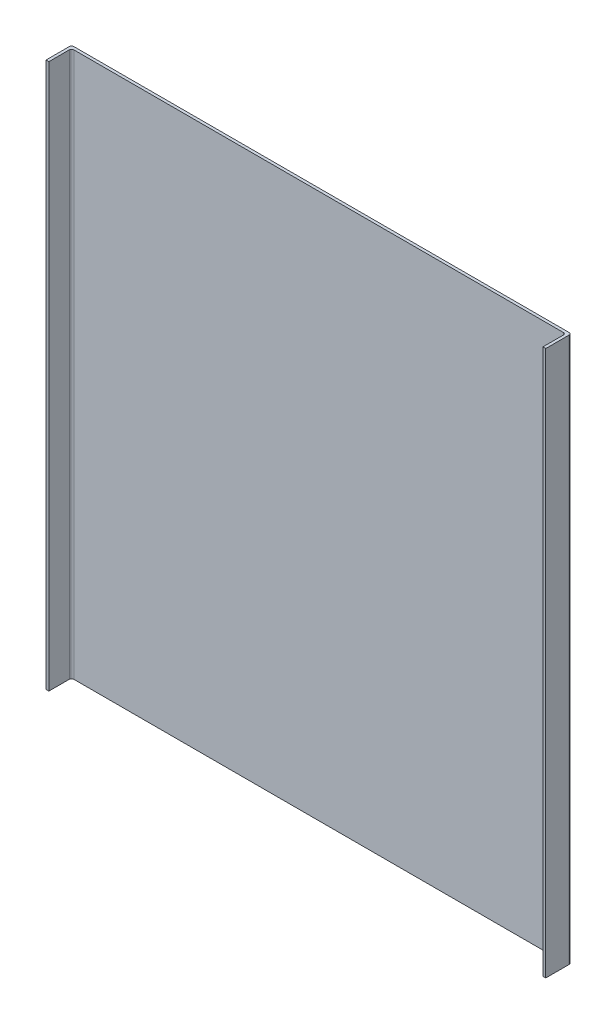
ISO-10303-21;
HEADER;
FILE_DESCRIPTION(('STEP AP214'),'2;1');
FILE_NAME('part.step','',(''),(''),'','','');
FILE_SCHEMA(('AUTOMOTIVE_DESIGN { 1 0 10303 214 1 1 1 1 }'));
ENDSEC;
DATA;
#1=APPLICATION_CONTEXT('core data for automotive mechanical design processes');
#2=APPLICATION_PROTOCOL_DEFINITION('international standard','automotive_design',2000,#1);
#3=PRODUCT_CONTEXT('',#1,'mechanical');
#4=PRODUCT('Part','Part','',(#3));
#5=PRODUCT_RELATED_PRODUCT_CATEGORY('part','',(#4));
#6=PRODUCT_DEFINITION_FORMATION('','',#4);
#7=PRODUCT_DEFINITION_CONTEXT('part definition',#1,'design');
#8=PRODUCT_DEFINITION('design','',#6,#7);
#9=PRODUCT_DEFINITION_SHAPE('','',#8);
#10=(LENGTH_UNIT() NAMED_UNIT(*) SI_UNIT(.MILLI.,.METRE.));
#11=(NAMED_UNIT(*) PLANE_ANGLE_UNIT() SI_UNIT($,.RADIAN.));
#12=(NAMED_UNIT(*) SI_UNIT($,.STERADIAN.) SOLID_ANGLE_UNIT());
#13=UNCERTAINTY_MEASURE_WITH_UNIT(LENGTH_MEASURE(1.E-05),#10,'distance_accuracy_value','');
#14=(GEOMETRIC_REPRESENTATION_CONTEXT(3) GLOBAL_UNCERTAINTY_ASSIGNED_CONTEXT((#13)) GLOBAL_UNIT_ASSIGNED_CONTEXT((#10,
#11,#12)) REPRESENTATION_CONTEXT('',''));
#15=CARTESIAN_POINT('',(0.,0.,0.));
#16=DIRECTION('',(0.,0.,1.));
#17=DIRECTION('',(1.,0.,0.));
#18=AXIS2_PLACEMENT_3D('',#15,#16,#17);
#19=CARTESIAN_POINT('',(0.,0.,6.35));
#20=DIRECTION('',(0.,0.,-1.));
#21=DIRECTION('',(-1.,0.,0.));
#22=AXIS2_PLACEMENT_3D('',#19,#20,#21);
#23=PLANE('',#22);
#24=DIRECTION('',(1.,0.,0.));
#25=VECTOR('',#24,1.);
#26=CARTESIAN_POINT('',(0.,0.,6.35));
#27=LINE('',#26,#25);
#28=CARTESIAN_POINT('',(11.3500000000001,0.,6.35));
#29=VERTEX_POINT('',#28);
#30=CARTESIAN_POINT('',(1106.25,0.,6.35));
#31=VERTEX_POINT('',#30);
#32=EDGE_CURVE('E197',#29,#31,#27,.T.);
#33=ORIENTED_EDGE('',*,*,#32,.T.);
#34=DIRECTION('',(0.,-1.,0.));
#35=VECTOR('',#34,1.);
#36=CARTESIAN_POINT('',(1106.25,1219.2,6.35));
#37=LINE('',#36,#35);
#38=CARTESIAN_POINT('',(1106.25,1219.2,6.35));
#39=VERTEX_POINT('',#38);
#40=EDGE_CURVE('E244',#31,#39,#37,.F.);
#41=ORIENTED_EDGE('',*,*,#40,.T.);
#42=DIRECTION('',(1.,0.,0.));
#43=VECTOR('',#42,1.);
#44=CARTESIAN_POINT('',(0.,1219.2,6.35));
#45=LINE('',#44,#43);
#46=CARTESIAN_POINT('',(11.35,1219.2,6.35));
#47=VERTEX_POINT('',#46);
#48=EDGE_CURVE('E193',#47,#39,#45,.T.);
#49=ORIENTED_EDGE('',*,*,#48,.F.);
#50=DIRECTION('',(0.,1.,0.));
#51=VECTOR('',#50,1.);
#52=CARTESIAN_POINT('',(11.3500000000001,0.,6.35));
#53=LINE('',#52,#51);
#54=EDGE_CURVE('E241',#47,#29,#53,.F.);
#55=ORIENTED_EDGE('',*,*,#54,.T.);
#56=EDGE_LOOP('',(#33,#41,#49,#55));
#57=FACE_BOUND('',#56,.T.);
#58=ADVANCED_FACE('F45',(#57),#23,.F.);
#59=CARTESIAN_POINT('',(0.,0.,6.35));
#60=DIRECTION('',(-1.,0.,0.));
#61=DIRECTION('',(0.,0.,1.));
#62=AXIS2_PLACEMENT_3D('',#59,#60,#61);
#63=PLANE('',#62);
#64=DIRECTION('',(0.,0.,-1.));
#65=VECTOR('',#64,1.);
#66=CARTESIAN_POINT('',(0.,1219.2,6.35));
#67=LINE('',#66,#65);
#68=CARTESIAN_POINT('',(0.,1219.2,57.15));
#69=VERTEX_POINT('',#68);
#70=CARTESIAN_POINT('',(0.,1219.2,5.));
#71=VERTEX_POINT('',#70);
#72=EDGE_CURVE('E202',#69,#71,#67,.T.);
#73=ORIENTED_EDGE('',*,*,#72,.T.);
#74=DIRECTION('',(0.,1.,0.));
#75=VECTOR('',#74,1.);
#76=CARTESIAN_POINT('',(0.,0.,5.));
#77=LINE('',#76,#75);
#78=CARTESIAN_POINT('',(0.,0.,5.));
#79=VERTEX_POINT('',#78);
#80=EDGE_CURVE('E61',#71,#79,#77,.F.);
#81=ORIENTED_EDGE('',*,*,#80,.T.);
#82=DIRECTION('',(0.,0.,-1.));
#83=VECTOR('',#82,1.);
#84=CARTESIAN_POINT('',(0.,0.,6.35));
#85=LINE('',#84,#83);
#86=CARTESIAN_POINT('',(0.,0.,57.15));
#87=VERTEX_POINT('',#86);
#88=EDGE_CURVE('E148',#87,#79,#85,.T.);
#89=ORIENTED_EDGE('',*,*,#88,.F.);
#90=DIRECTION('',(0.,-1.,0.));
#91=VECTOR('',#90,1.);
#92=CARTESIAN_POINT('',(0.,1219.2,57.15));
#93=LINE('',#92,#91);
#94=EDGE_CURVE('E165',#69,#87,#93,.T.);
#95=ORIENTED_EDGE('',*,*,#94,.F.);
#96=EDGE_LOOP('',(#73,#81,#89,#95));
#97=FACE_BOUND('',#96,.T.);
#98=ADVANCED_FACE('F276',(#97),#63,.T.);
#99=CARTESIAN_POINT('',(0.,0.,6.35));
#100=DIRECTION('',(0.,1.,0.));
#101=DIRECTION('',(0.,0.,1.));
#102=AXIS2_PLACEMENT_3D('',#99,#100,#101);
#103=PLANE('',#102);
#104=DIRECTION('',(1.,0.,0.));
#105=VECTOR('',#104,1.);
#106=CARTESIAN_POINT('',(0.,0.,0.));
#107=LINE('',#106,#105);
#108=CARTESIAN_POINT('',(5.,0.,0.));
#109=VERTEX_POINT('',#108);
#110=CARTESIAN_POINT('',(1112.6,0.,0.));
#111=VERTEX_POINT('',#110);
#112=EDGE_CURVE('E198',#109,#111,#107,.T.);
#113=ORIENTED_EDGE('',*,*,#112,.T.);
#114=CARTESIAN_POINT('',(1112.6,0.,5.));
#115=DIRECTION('',(0.,1.,0.));
#116=DIRECTION('',(0.,0.,1.));
#117=AXIS2_PLACEMENT_3D('',#114,#115,#116);
#118=CIRCLE('',#117,5.);
#119=CARTESIAN_POINT('',(1117.6,0.,5.));
#120=VERTEX_POINT('',#119);
#121=EDGE_CURVE('E142',#111,#120,#118,.F.);
#122=ORIENTED_EDGE('',*,*,#121,.T.);
#123=DIRECTION('',(0.,0.,-1.));
#124=VECTOR('',#123,1.);
#125=CARTESIAN_POINT('',(1117.6,0.,6.35));
#126=LINE('',#125,#124);
#127=CARTESIAN_POINT('',(1117.6,0.,57.15));
#128=VERTEX_POINT('',#127);
#129=EDGE_CURVE('E135',#128,#120,#126,.T.);
#130=ORIENTED_EDGE('',*,*,#129,.F.);
#131=DIRECTION('',(1.,0.,0.));
#132=VECTOR('',#131,1.);
#133=CARTESIAN_POINT('',(1117.6,0.,57.15));
#134=LINE('',#133,#132);
#135=CARTESIAN_POINT('',(1111.25,0.,57.15));
#136=VERTEX_POINT('',#135);
#137=EDGE_CURVE('E140',#136,#128,#134,.T.);
#138=ORIENTED_EDGE('',*,*,#137,.F.);
#139=DIRECTION('',(0.,0.,-1.));
#140=VECTOR('',#139,1.);
#141=CARTESIAN_POINT('',(1111.25,0.,57.15));
#142=LINE('',#141,#140);
#143=CARTESIAN_POINT('',(1111.25,0.,11.35));
#144=VERTEX_POINT('',#143);
#145=EDGE_CURVE('E159',#136,#144,#142,.T.);
#146=ORIENTED_EDGE('',*,*,#145,.T.);
#147=CARTESIAN_POINT('',(1106.25,0.,11.35));
#148=DIRECTION('',(0.,1.,0.));
#149=DIRECTION('',(0.,0.,1.));
#150=AXIS2_PLACEMENT_3D('',#147,#148,#149);
#151=CIRCLE('',#150,5.);
#152=EDGE_CURVE('E251',#144,#31,#151,.T.);
#153=ORIENTED_EDGE('',*,*,#152,.T.);
#154=ORIENTED_EDGE('',*,*,#32,.F.);
#155=CARTESIAN_POINT('',(11.3500000000001,0.,11.35));
#156=DIRECTION('',(0.,1.,0.));
#157=DIRECTION('',(0.,0.,1.));
#158=AXIS2_PLACEMENT_3D('',#155,#156,#157);
#159=CIRCLE('',#158,5.);
#160=CARTESIAN_POINT('',(6.35000000000015,0.,11.35));
#161=VERTEX_POINT('',#160);
#162=EDGE_CURVE('E11',#29,#161,#159,.T.);
#163=ORIENTED_EDGE('',*,*,#162,.T.);
#164=DIRECTION('',(0.,0.,-1.));
#165=VECTOR('',#164,1.);
#166=CARTESIAN_POINT('',(6.35000000000015,0.,57.15));
#167=LINE('',#166,#165);
#168=CARTESIAN_POINT('',(6.35000000000015,0.,57.15));
#169=VERTEX_POINT('',#168);
#170=EDGE_CURVE('E189',#169,#161,#167,.T.);
#171=ORIENTED_EDGE('',*,*,#170,.F.);
#172=DIRECTION('',(1.,0.,0.));
#173=VECTOR('',#172,1.);
#174=CARTESIAN_POINT('',(0.,0.,57.15));
#175=LINE('',#174,#173);
#176=EDGE_CURVE('E171',#87,#169,#175,.T.);
#177=ORIENTED_EDGE('',*,*,#176,.F.);
#178=ORIENTED_EDGE('',*,*,#88,.T.);
#179=CARTESIAN_POINT('',(5.,0.,5.));
#180=DIRECTION('',(0.,1.,0.));
#181=DIRECTION('',(0.,0.,1.));
#182=AXIS2_PLACEMENT_3D('',#179,#180,#181);
#183=CIRCLE('',#182,5.);
#184=EDGE_CURVE('E230',#79,#109,#183,.F.);
#185=ORIENTED_EDGE('',*,*,#184,.T.);
#186=EDGE_LOOP('',(#113,#122,#130,#138,#146,#153,#154,#163,#171,#177,#178,#185));
#187=FACE_BOUND('',#186,.T.);
#188=ADVANCED_FACE('F138',(#187),#103,.F.);
#189=CARTESIAN_POINT('',(1117.6,0.,6.35));
#190=DIRECTION('',(-1.,0.,0.));
#191=DIRECTION('',(0.,0.,1.));
#192=AXIS2_PLACEMENT_3D('',#189,#190,#191);
#193=PLANE('',#192);
#194=ORIENTED_EDGE('',*,*,#129,.T.);
#195=DIRECTION('',(0.,1.,0.));
#196=VECTOR('',#195,1.);
#197=CARTESIAN_POINT('',(1117.6,1219.2,5.));
#198=LINE('',#197,#196);
#199=CARTESIAN_POINT('',(1117.6,1219.2,5.));
#200=VERTEX_POINT('',#199);
#201=EDGE_CURVE('E209',#120,#200,#198,.T.);
#202=ORIENTED_EDGE('',*,*,#201,.T.);
#203=DIRECTION('',(0.,0.,-1.));
#204=VECTOR('',#203,1.);
#205=CARTESIAN_POINT('',(1117.6,1219.2,6.35));
#206=LINE('',#205,#204);
#207=CARTESIAN_POINT('',(1117.6,1219.2,57.15));
#208=VERTEX_POINT('',#207);
#209=EDGE_CURVE('E149',#208,#200,#206,.T.);
#210=ORIENTED_EDGE('',*,*,#209,.F.);
#211=DIRECTION('',(0.,1.,0.));
#212=VECTOR('',#211,1.);
#213=CARTESIAN_POINT('',(1117.6,1219.2,57.15));
#214=LINE('',#213,#212);
#215=EDGE_CURVE('E154',#128,#208,#214,.T.);
#216=ORIENTED_EDGE('',*,*,#215,.F.);
#217=EDGE_LOOP('',(#194,#202,#210,#216));
#218=FACE_BOUND('',#217,.T.);
#219=ADVANCED_FACE('F161',(#218),#193,.F.);
#220=CARTESIAN_POINT('',(0.,1219.2,6.35));
#221=DIRECTION('',(0.,1.,0.));
#222=DIRECTION('',(0.,0.,1.));
#223=AXIS2_PLACEMENT_3D('',#220,#221,#222);
#224=PLANE('',#223);
#225=ORIENTED_EDGE('',*,*,#209,.T.);
#226=CARTESIAN_POINT('',(1112.6,1219.2,5.));
#227=DIRECTION('',(0.,1.,0.));
#228=DIRECTION('',(0.,0.,1.));
#229=AXIS2_PLACEMENT_3D('',#226,#227,#228);
#230=CIRCLE('',#229,5.);
#231=CARTESIAN_POINT('',(1112.6,1219.2,0.));
#232=VERTEX_POINT('',#231);
#233=EDGE_CURVE('E220',#200,#232,#230,.T.);
#234=ORIENTED_EDGE('',*,*,#233,.T.);
#235=DIRECTION('',(1.,0.,0.));
#236=VECTOR('',#235,1.);
#237=CARTESIAN_POINT('',(0.,1219.2,0.));
#238=LINE('',#237,#236);
#239=CARTESIAN_POINT('',(5.,1219.2,0.));
#240=VERTEX_POINT('',#239);
#241=EDGE_CURVE('E192',#240,#232,#238,.T.);
#242=ORIENTED_EDGE('',*,*,#241,.F.);
#243=CARTESIAN_POINT('',(5.,1219.2,5.));
#244=DIRECTION('',(0.,1.,0.));
#245=DIRECTION('',(0.,0.,1.));
#246=AXIS2_PLACEMENT_3D('',#243,#244,#245);
#247=CIRCLE('',#246,5.);
#248=EDGE_CURVE('E217',#240,#71,#247,.T.);
#249=ORIENTED_EDGE('',*,*,#248,.T.);
#250=ORIENTED_EDGE('',*,*,#72,.F.);
#251=DIRECTION('',(-1.,0.,0.));
#252=VECTOR('',#251,1.);
#253=CARTESIAN_POINT('',(0.,1219.2,57.15));
#254=LINE('',#253,#252);
#255=CARTESIAN_POINT('',(6.35,1219.2,57.15));
#256=VERTEX_POINT('',#255);
#257=EDGE_CURVE('E181',#256,#69,#254,.T.);
#258=ORIENTED_EDGE('',*,*,#257,.F.);
#259=DIRECTION('',(0.,0.,-1.));
#260=VECTOR('',#259,1.);
#261=CARTESIAN_POINT('',(6.35,1219.2,57.15));
#262=LINE('',#261,#260);
#263=CARTESIAN_POINT('',(6.35,1219.2,11.35));
#264=VERTEX_POINT('',#263);
#265=EDGE_CURVE('E185',#256,#264,#262,.T.);
#266=ORIENTED_EDGE('',*,*,#265,.T.);
#267=CARTESIAN_POINT('',(11.35,1219.2,11.35));
#268=DIRECTION('',(0.,1.,0.));
#269=DIRECTION('',(0.,0.,1.));
#270=AXIS2_PLACEMENT_3D('',#267,#268,#269);
#271=CIRCLE('',#270,5.);
#272=EDGE_CURVE('E54',#264,#47,#271,.F.);
#273=ORIENTED_EDGE('',*,*,#272,.T.);
#274=ORIENTED_EDGE('',*,*,#48,.T.);
#275=CARTESIAN_POINT('',(1106.25,1219.2,11.35));
#276=DIRECTION('',(0.,1.,0.));
#277=DIRECTION('',(0.,0.,1.));
#278=AXIS2_PLACEMENT_3D('',#275,#276,#277);
#279=CIRCLE('',#278,5.);
#280=CARTESIAN_POINT('',(1111.25,1219.2,11.35));
#281=VERTEX_POINT('',#280);
#282=EDGE_CURVE('E254',#39,#281,#279,.F.);
#283=ORIENTED_EDGE('',*,*,#282,.T.);
#284=DIRECTION('',(0.,0.,-1.));
#285=VECTOR('',#284,1.);
#286=CARTESIAN_POINT('',(1111.25,1219.2,57.15));
#287=LINE('',#286,#285);
#288=CARTESIAN_POINT('',(1111.25,1219.2,57.15));
#289=VERTEX_POINT('',#288);
#290=EDGE_CURVE('E289',#289,#281,#287,.T.);
#291=ORIENTED_EDGE('',*,*,#290,.F.);
#292=DIRECTION('',(-1.,0.,0.));
#293=VECTOR('',#292,1.);
#294=CARTESIAN_POINT('',(1117.6,1219.2,57.15));
#295=LINE('',#294,#293);
#296=EDGE_CURVE('E166',#208,#289,#295,.T.);
#297=ORIENTED_EDGE('',*,*,#296,.F.);
#298=EDGE_LOOP('',(#225,#234,#242,#249,#250,#258,#266,#273,#274,#283,#291,#297));
#299=FACE_BOUND('',#298,.T.);
#300=ADVANCED_FACE('F259',(#299),#224,.T.);
#301=CARTESIAN_POINT('',(0.,0.,0.));
#302=DIRECTION('',(0.,0.,-1.));
#303=DIRECTION('',(-1.,0.,0.));
#304=AXIS2_PLACEMENT_3D('',#301,#302,#303);
#305=PLANE('',#304);
#306=ORIENTED_EDGE('',*,*,#241,.T.);
#307=DIRECTION('',(0.,1.,0.));
#308=VECTOR('',#307,1.);
#309=CARTESIAN_POINT('',(1112.6,0.,0.));
#310=LINE('',#309,#308);
#311=EDGE_CURVE('E227',#232,#111,#310,.F.);
#312=ORIENTED_EDGE('',*,*,#311,.T.);
#313=ORIENTED_EDGE('',*,*,#112,.F.);
#314=DIRECTION('',(0.,1.,0.));
#315=VECTOR('',#314,1.);
#316=CARTESIAN_POINT('',(5.,0.,0.));
#317=LINE('',#316,#315);
#318=EDGE_CURVE('E223',#109,#240,#317,.T.);
#319=ORIENTED_EDGE('',*,*,#318,.T.);
#320=EDGE_LOOP('',(#306,#312,#313,#319));
#321=FACE_BOUND('',#320,.T.);
#322=ADVANCED_FACE('F282',(#321),#305,.T.);
#323=CARTESIAN_POINT('',(6.35,1219.2,57.15));
#324=DIRECTION('',(-1.,0.,0.));
#325=DIRECTION('',(0.,-1.,0.));
#326=AXIS2_PLACEMENT_3D('',#323,#324,#325);
#327=PLANE('',#326);
#328=ORIENTED_EDGE('',*,*,#170,.T.);
#329=DIRECTION('',(0.,1.,0.));
#330=VECTOR('',#329,1.);
#331=CARTESIAN_POINT('',(6.35,1219.2,11.35));
#332=LINE('',#331,#330);
#333=EDGE_CURVE('E247',#161,#264,#332,.T.);
#334=ORIENTED_EDGE('',*,*,#333,.T.);
#335=ORIENTED_EDGE('',*,*,#265,.F.);
#336=DIRECTION('',(0.,1.,0.));
#337=VECTOR('',#336,1.);
#338=CARTESIAN_POINT('',(6.35,1219.2,57.15));
#339=LINE('',#338,#337);
#340=EDGE_CURVE('E178',#169,#256,#339,.T.);
#341=ORIENTED_EDGE('',*,*,#340,.F.);
#342=EDGE_LOOP('',(#328,#334,#335,#341));
#343=FACE_BOUND('',#342,.T.);
#344=ADVANCED_FACE('F269',(#343),#327,.F.);
#345=CARTESIAN_POINT('',(0.,0.,57.15));
#346=DIRECTION('',(0.,0.,1.));
#347=DIRECTION('',(1.,0.,0.));
#348=AXIS2_PLACEMENT_3D('',#345,#346,#347);
#349=PLANE('',#348);
#350=ORIENTED_EDGE('',*,*,#94,.T.);
#351=ORIENTED_EDGE('',*,*,#176,.T.);
#352=ORIENTED_EDGE('',*,*,#340,.T.);
#353=ORIENTED_EDGE('',*,*,#257,.T.);
#354=EDGE_LOOP('',(#350,#351,#352,#353));
#355=FACE_BOUND('',#354,.T.);
#356=ADVANCED_FACE('F275',(#355),#349,.T.);
#357=CARTESIAN_POINT('',(1111.25,1219.2,57.15));
#358=DIRECTION('',(1.,0.,0.));
#359=DIRECTION('',(0.,1.,0.));
#360=AXIS2_PLACEMENT_3D('',#357,#358,#359);
#361=PLANE('',#360);
#362=ORIENTED_EDGE('',*,*,#290,.T.);
#363=DIRECTION('',(0.,-1.,0.));
#364=VECTOR('',#363,1.);
#365=CARTESIAN_POINT('',(1111.25,0.,11.35));
#366=LINE('',#365,#364);
#367=EDGE_CURVE('E237',#281,#144,#366,.T.);
#368=ORIENTED_EDGE('',*,*,#367,.T.);
#369=ORIENTED_EDGE('',*,*,#145,.F.);
#370=DIRECTION('',(0.,-1.,0.));
#371=VECTOR('',#370,1.);
#372=CARTESIAN_POINT('',(1111.25,1219.2,57.15));
#373=LINE('',#372,#371);
#374=EDGE_CURVE('E156',#289,#136,#373,.T.);
#375=ORIENTED_EDGE('',*,*,#374,.F.);
#376=EDGE_LOOP('',(#362,#368,#369,#375));
#377=FACE_BOUND('',#376,.T.);
#378=ADVANCED_FACE('F294',(#377),#361,.F.);
#379=CARTESIAN_POINT('',(0.,0.,57.15));
#380=DIRECTION('',(0.,0.,-1.));
#381=DIRECTION('',(-1.,0.,0.));
#382=AXIS2_PLACEMENT_3D('',#379,#380,#381);
#383=PLANE('',#382);
#384=ORIENTED_EDGE('',*,*,#215,.T.);
#385=ORIENTED_EDGE('',*,*,#296,.T.);
#386=ORIENTED_EDGE('',*,*,#374,.T.);
#387=ORIENTED_EDGE('',*,*,#137,.T.);
#388=EDGE_LOOP('',(#384,#385,#386,#387));
#389=FACE_BOUND('',#388,.T.);
#390=ADVANCED_FACE('F153',(#389),#383,.F.);
#391=CARTESIAN_POINT('',(1112.6,0.,5.));
#392=DIRECTION('',(0.,-1.,0.));
#393=DIRECTION('',(0.,0.,-1.));
#394=AXIS2_PLACEMENT_3D('',#391,#392,#393);
#395=CYLINDRICAL_SURFACE('',#394,5.);
#396=ORIENTED_EDGE('',*,*,#121,.F.);
#397=ORIENTED_EDGE('',*,*,#311,.F.);
#398=ORIENTED_EDGE('',*,*,#233,.F.);
#399=ORIENTED_EDGE('',*,*,#201,.F.);
#400=EDGE_LOOP('',(#396,#397,#398,#399));
#401=FACE_BOUND('',#400,.T.);
#402=ADVANCED_FACE('F286',(#401),#395,.T.);
#403=CARTESIAN_POINT('',(5.,0.,5.));
#404=DIRECTION('',(0.,1.,0.));
#405=DIRECTION('',(0.,0.,1.));
#406=AXIS2_PLACEMENT_3D('',#403,#404,#405);
#407=CYLINDRICAL_SURFACE('',#406,5.);
#408=ORIENTED_EDGE('',*,*,#184,.F.);
#409=ORIENTED_EDGE('',*,*,#80,.F.);
#410=ORIENTED_EDGE('',*,*,#248,.F.);
#411=ORIENTED_EDGE('',*,*,#318,.F.);
#412=EDGE_LOOP('',(#408,#409,#410,#411));
#413=FACE_BOUND('',#412,.T.);
#414=ADVANCED_FACE('F278',(#413),#407,.T.);
#415=CARTESIAN_POINT('',(1106.25,1219.2,11.35));
#416=DIRECTION('',(0.,1.,0.));
#417=DIRECTION('',(-1.,0.,0.));
#418=AXIS2_PLACEMENT_3D('',#415,#416,#417);
#419=CYLINDRICAL_SURFACE('',#418,5.);
#420=ORIENTED_EDGE('',*,*,#282,.F.);
#421=ORIENTED_EDGE('',*,*,#40,.F.);
#422=ORIENTED_EDGE('',*,*,#152,.F.);
#423=ORIENTED_EDGE('',*,*,#367,.F.);
#424=EDGE_LOOP('',(#420,#421,#422,#423));
#425=FACE_BOUND('',#424,.T.);
#426=ADVANCED_FACE('F299',(#425),#419,.F.);
#427=CARTESIAN_POINT('',(11.35,1219.2,11.35));
#428=DIRECTION('',(0.,-1.,0.));
#429=DIRECTION('',(1.,0.,0.));
#430=AXIS2_PLACEMENT_3D('',#427,#428,#429);
#431=CYLINDRICAL_SURFACE('',#430,5.);
#432=ORIENTED_EDGE('',*,*,#162,.F.);
#433=ORIENTED_EDGE('',*,*,#54,.F.);
#434=ORIENTED_EDGE('',*,*,#272,.F.);
#435=ORIENTED_EDGE('',*,*,#333,.F.);
#436=EDGE_LOOP('',(#432,#433,#434,#435));
#437=FACE_BOUND('',#436,.T.);
#438=ADVANCED_FACE('F47',(#437),#431,.F.);
#439=CLOSED_SHELL('',(#58,#98,#188,#219,#300,#322,#344,#356,#378,#390,#402,#414,#426,#438));
#440=MANIFOLD_SOLID_BREP('B2',#439);
#441=ADVANCED_BREP_SHAPE_REPRESENTATION('',(#18,#440),#14);
#442=SHAPE_DEFINITION_REPRESENTATION(#9,#441);
ENDSEC;
END-ISO-10303-21;
